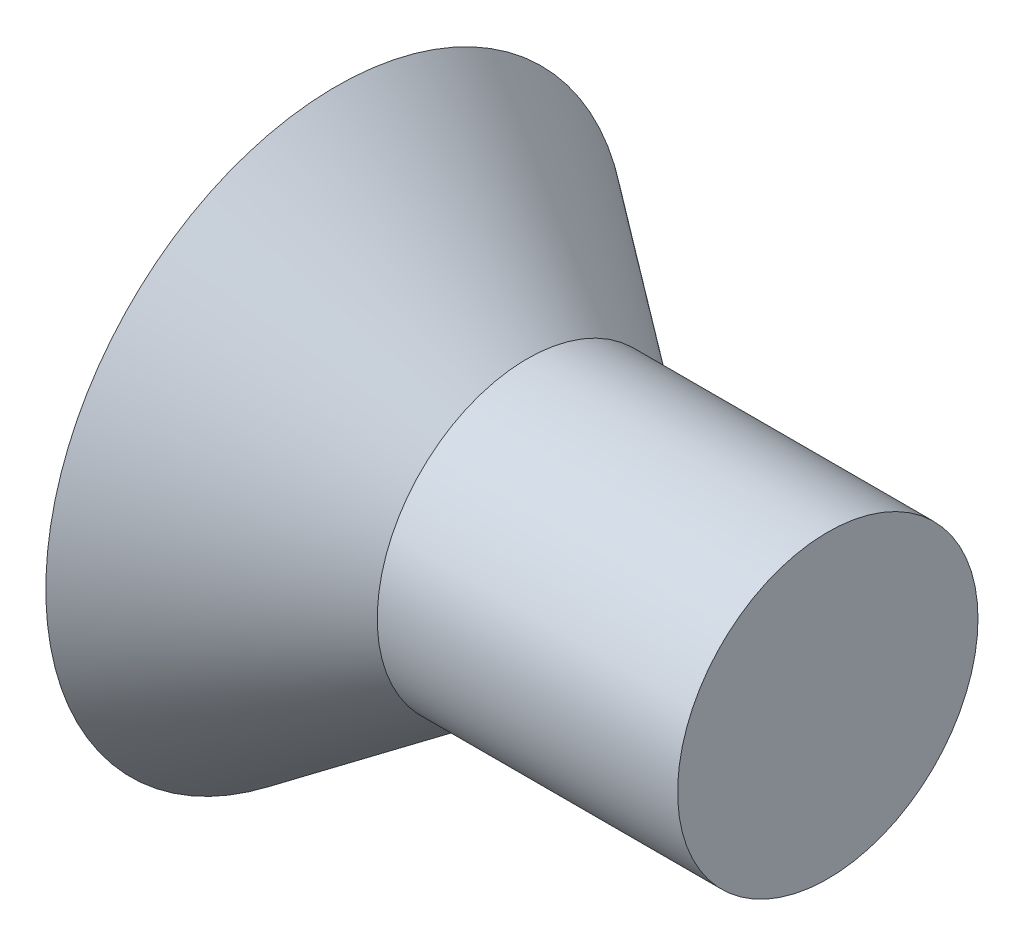
ISO-10303-21;
HEADER;
FILE_DESCRIPTION(('STEP AP214'),'2;1');
FILE_NAME('part.step','',(''),(''),'','','');
FILE_SCHEMA(('AUTOMOTIVE_DESIGN { 1 0 10303 214 1 1 1 1 }'));
ENDSEC;
DATA;
#1=APPLICATION_CONTEXT('core data for automotive mechanical design processes');
#2=APPLICATION_PROTOCOL_DEFINITION('international standard','automotive_design',2000,#1);
#3=PRODUCT_CONTEXT('',#1,'mechanical');
#4=PRODUCT('Part','Part','',(#3));
#5=PRODUCT_RELATED_PRODUCT_CATEGORY('part','',(#4));
#6=PRODUCT_DEFINITION_FORMATION('','',#4);
#7=PRODUCT_DEFINITION_CONTEXT('part definition',#1,'design');
#8=PRODUCT_DEFINITION('design','',#6,#7);
#9=PRODUCT_DEFINITION_SHAPE('','',#8);
#10=(LENGTH_UNIT() NAMED_UNIT(*) SI_UNIT(.MILLI.,.METRE.));
#11=(NAMED_UNIT(*) PLANE_ANGLE_UNIT() SI_UNIT($,.RADIAN.));
#12=(NAMED_UNIT(*) SI_UNIT($,.STERADIAN.) SOLID_ANGLE_UNIT());
#13=UNCERTAINTY_MEASURE_WITH_UNIT(LENGTH_MEASURE(1.E-05),#10,'distance_accuracy_value','');
#14=(GEOMETRIC_REPRESENTATION_CONTEXT(3) GLOBAL_UNCERTAINTY_ASSIGNED_CONTEXT((#13)) GLOBAL_UNIT_ASSIGNED_CONTEXT((#10,
#11,#12)) REPRESENTATION_CONTEXT('',''));
#15=CARTESIAN_POINT('',(0.,0.,0.));
#16=DIRECTION('',(0.,0.,1.));
#17=DIRECTION('',(1.,0.,0.));
#18=AXIS2_PLACEMENT_3D('',#15,#16,#17);
#19=CARTESIAN_POINT('',(4.91,0.,0.));
#20=DIRECTION('',(1.,0.,0.));
#21=DIRECTION('',(0.,0.,-1.));
#22=AXIS2_PLACEMENT_3D('',#19,#20,#21);
#23=CYLINDRICAL_SURFACE('',#22,1.5);
#24=CARTESIAN_POINT('',(1.91,0.,0.));
#25=DIRECTION('',(1.,0.,0.));
#26=DIRECTION('',(0.,0.,-1.));
#27=AXIS2_PLACEMENT_3D('',#24,#25,#26);
#28=CIRCLE('',#27,1.5);
#29=CARTESIAN_POINT('',(1.91,0.,-1.5));
#30=VERTEX_POINT('',#29);
#31=EDGE_CURVE('E11',#30,#30,#28,.T.);
#32=ORIENTED_EDGE('',*,*,#31,.T.);
#33=EDGE_LOOP('',(#32));
#34=FACE_BOUND('',#33,.T.);
#35=CARTESIAN_POINT('',(4.91,0.,0.));
#36=DIRECTION('',(1.,0.,0.));
#37=DIRECTION('',(0.,0.,-1.));
#38=AXIS2_PLACEMENT_3D('',#35,#36,#37);
#39=CIRCLE('',#38,1.5);
#40=CARTESIAN_POINT('',(4.91,0.,-1.5));
#41=VERTEX_POINT('',#40);
#42=EDGE_CURVE('E134',#41,#41,#39,.T.);
#43=ORIENTED_EDGE('',*,*,#42,.F.);
#44=EDGE_LOOP('',(#43));
#45=FACE_BOUND('',#44,.T.);
#46=ADVANCED_FACE('F33',(#34,#45),#23,.T.);
#47=CARTESIAN_POINT('',(1.91,0.,0.));
#48=DIRECTION('',(-1.,0.,0.));
#49=DIRECTION('',(0.,0.,1.));
#50=AXIS2_PLACEMENT_3D('',#47,#48,#49);
#51=CONICAL_SURFACE('',#50,1.5,0.632521820250123);
#52=CARTESIAN_POINT('',(0.,0.,0.));
#53=DIRECTION('',(1.,0.,0.));
#54=DIRECTION('',(0.,0.,-1.));
#55=AXIS2_PLACEMENT_3D('',#52,#53,#54);
#56=CIRCLE('',#55,2.9);
#57=CARTESIAN_POINT('',(0.,0.,-2.9));
#58=VERTEX_POINT('',#57);
#59=EDGE_CURVE('E40',#58,#58,#56,.T.);
#60=ORIENTED_EDGE('',*,*,#59,.T.);
#61=EDGE_LOOP('',(#60));
#62=FACE_BOUND('',#61,.T.);
#63=ORIENTED_EDGE('',*,*,#31,.F.);
#64=EDGE_LOOP('',(#63));
#65=FACE_BOUND('',#64,.T.);
#66=ADVANCED_FACE('F144',(#62,#65),#51,.T.);
#67=CARTESIAN_POINT('',(0.,2.9,0.));
#68=DIRECTION('',(-1.,0.,0.));
#69=DIRECTION('',(0.,0.,1.));
#70=AXIS2_PLACEMENT_3D('',#67,#68,#69);
#71=PLANE('',#70);
#72=DIRECTION('',(0.,0.866025403784439,0.5));
#73=VECTOR('',#72,1.);
#74=CARTESIAN_POINT('',(0.,-1.,0.577350269189626));
#75=LINE('',#74,#73);
#76=CARTESIAN_POINT('',(0.,-1.,0.577350269189626));
#77=VERTEX_POINT('',#76);
#78=CARTESIAN_POINT('',(0.,0.,1.15470053837925));
#79=VERTEX_POINT('',#78);
#80=EDGE_CURVE('E47',#77,#79,#75,.T.);
#81=ORIENTED_EDGE('',*,*,#80,.F.);
#82=DIRECTION('',(0.,0.,1.));
#83=VECTOR('',#82,1.);
#84=CARTESIAN_POINT('',(0.,-1.,-0.577350269189626));
#85=LINE('',#84,#83);
#86=CARTESIAN_POINT('',(0.,-1.,-0.577350269189626));
#87=VERTEX_POINT('',#86);
#88=EDGE_CURVE('E130',#87,#77,#85,.T.);
#89=ORIENTED_EDGE('',*,*,#88,.F.);
#90=DIRECTION('',(0.,-0.866025403784439,0.5));
#91=VECTOR('',#90,1.);
#92=CARTESIAN_POINT('',(0.,0.,-1.15470053837925));
#93=LINE('',#92,#91);
#94=CARTESIAN_POINT('',(0.,0.,-1.15470053837925));
#95=VERTEX_POINT('',#94);
#96=EDGE_CURVE('E128',#95,#87,#93,.T.);
#97=ORIENTED_EDGE('',*,*,#96,.F.);
#98=DIRECTION('',(0.,-0.866025403784439,-0.5));
#99=VECTOR('',#98,1.);
#100=CARTESIAN_POINT('',(0.,1.,-0.577350269189626));
#101=LINE('',#100,#99);
#102=CARTESIAN_POINT('',(0.,1.,-0.577350269189626));
#103=VERTEX_POINT('',#102);
#104=EDGE_CURVE('E95',#103,#95,#101,.T.);
#105=ORIENTED_EDGE('',*,*,#104,.F.);
#106=DIRECTION('',(0.,0.,-1.));
#107=VECTOR('',#106,1.);
#108=CARTESIAN_POINT('',(0.,1.,0.577350269189625));
#109=LINE('',#108,#107);
#110=CARTESIAN_POINT('',(0.,1.,0.577350269189625));
#111=VERTEX_POINT('',#110);
#112=EDGE_CURVE('E124',#111,#103,#109,.T.);
#113=ORIENTED_EDGE('',*,*,#112,.F.);
#114=DIRECTION('',(0.,0.866025403784438,-0.5));
#115=VECTOR('',#114,1.);
#116=CARTESIAN_POINT('',(0.,0.,1.15470053837925));
#117=LINE('',#116,#115);
#118=EDGE_CURVE('E121',#79,#111,#117,.T.);
#119=ORIENTED_EDGE('',*,*,#118,.F.);
#120=EDGE_LOOP('',(#81,#89,#97,#105,#113,#119));
#121=FACE_BOUND('',#120,.T.);
#122=ORIENTED_EDGE('',*,*,#59,.F.);
#123=EDGE_LOOP('',(#122));
#124=FACE_BOUND('',#123,.T.);
#125=ADVANCED_FACE('F147',(#121,#124),#71,.T.);
#126=CARTESIAN_POINT('',(4.91,0.,0.));
#127=DIRECTION('',(1.,0.,0.));
#128=DIRECTION('',(0.,0.,-1.));
#129=AXIS2_PLACEMENT_3D('',#126,#127,#128);
#130=PLANE('',#129);
#131=ORIENTED_EDGE('',*,*,#42,.T.);
#132=EDGE_LOOP('',(#131));
#133=FACE_BOUND('',#132,.T.);
#134=ADVANCED_FACE('F149',(#133),#130,.T.);
#135=CARTESIAN_POINT('',(1.,-1.,0.577350269189626));
#136=DIRECTION('',(0.,-0.5,0.866025403784439));
#137=DIRECTION('',(0.,-0.866025403784439,-0.5));
#138=AXIS2_PLACEMENT_3D('',#135,#136,#137);
#139=PLANE('',#138);
#140=ORIENTED_EDGE('',*,*,#80,.T.);
#141=DIRECTION('',(-1.,0.,0.));
#142=VECTOR('',#141,1.);
#143=CARTESIAN_POINT('',(1.,0.,1.15470053837925));
#144=LINE('',#143,#142);
#145=CARTESIAN_POINT('',(1.,0.,1.15470053837925));
#146=VERTEX_POINT('',#145);
#147=EDGE_CURVE('E77',#146,#79,#144,.T.);
#148=ORIENTED_EDGE('',*,*,#147,.F.);
#149=DIRECTION('',(0.,0.866025403784439,0.5));
#150=VECTOR('',#149,1.);
#151=CARTESIAN_POINT('',(1.,-1.,0.577350269189626));
#152=LINE('',#151,#150);
#153=CARTESIAN_POINT('',(1.,-1.,0.577350269189626));
#154=VERTEX_POINT('',#153);
#155=EDGE_CURVE('E132',#154,#146,#152,.T.);
#156=ORIENTED_EDGE('',*,*,#155,.F.);
#157=DIRECTION('',(-1.,0.,0.));
#158=VECTOR('',#157,1.);
#159=CARTESIAN_POINT('',(1.,-1.,0.577350269189626));
#160=LINE('',#159,#158);
#161=EDGE_CURVE('E55',#154,#77,#160,.T.);
#162=ORIENTED_EDGE('',*,*,#161,.T.);
#163=EDGE_LOOP('',(#140,#148,#156,#162));
#164=FACE_BOUND('',#163,.T.);
#165=ADVANCED_FACE('F156',(#164),#139,.F.);
#166=CARTESIAN_POINT('',(1.,-1.,-0.577350269189626));
#167=DIRECTION('',(0.,-1.,0.));
#168=DIRECTION('',(0.,0.,-1.));
#169=AXIS2_PLACEMENT_3D('',#166,#167,#168);
#170=PLANE('',#169);
#171=ORIENTED_EDGE('',*,*,#88,.T.);
#172=ORIENTED_EDGE('',*,*,#161,.F.);
#173=DIRECTION('',(0.,0.,1.));
#174=VECTOR('',#173,1.);
#175=CARTESIAN_POINT('',(1.,-1.,-0.577350269189626));
#176=LINE('',#175,#174);
#177=CARTESIAN_POINT('',(1.,-1.,-0.577350269189626));
#178=VERTEX_POINT('',#177);
#179=EDGE_CURVE('E107',#178,#154,#176,.T.);
#180=ORIENTED_EDGE('',*,*,#179,.F.);
#181=DIRECTION('',(-1.,0.,0.));
#182=VECTOR('',#181,1.);
#183=CARTESIAN_POINT('',(1.,-1.,-0.577350269189626));
#184=LINE('',#183,#182);
#185=EDGE_CURVE('E99',#178,#87,#184,.T.);
#186=ORIENTED_EDGE('',*,*,#185,.T.);
#187=EDGE_LOOP('',(#171,#172,#180,#186));
#188=FACE_BOUND('',#187,.T.);
#189=ADVANCED_FACE('F189',(#188),#170,.F.);
#190=CARTESIAN_POINT('',(1.,0.,-1.15470053837925));
#191=DIRECTION('',(0.,-0.5,-0.866025403784439));
#192=DIRECTION('',(0.,0.866025403784439,-0.5));
#193=AXIS2_PLACEMENT_3D('',#190,#191,#192);
#194=PLANE('',#193);
#195=ORIENTED_EDGE('',*,*,#96,.T.);
#196=ORIENTED_EDGE('',*,*,#185,.F.);
#197=DIRECTION('',(0.,-0.866025403784439,0.5));
#198=VECTOR('',#197,1.);
#199=CARTESIAN_POINT('',(1.,0.,-1.15470053837925));
#200=LINE('',#199,#198);
#201=CARTESIAN_POINT('',(1.,0.,-1.15470053837925));
#202=VERTEX_POINT('',#201);
#203=EDGE_CURVE('E103',#202,#178,#200,.T.);
#204=ORIENTED_EDGE('',*,*,#203,.F.);
#205=DIRECTION('',(-1.,0.,0.));
#206=VECTOR('',#205,1.);
#207=CARTESIAN_POINT('',(1.,0.,-1.15470053837925));
#208=LINE('',#207,#206);
#209=EDGE_CURVE('E88',#202,#95,#208,.T.);
#210=ORIENTED_EDGE('',*,*,#209,.T.);
#211=EDGE_LOOP('',(#195,#196,#204,#210));
#212=FACE_BOUND('',#211,.T.);
#213=ADVANCED_FACE('F104',(#212),#194,.F.);
#214=CARTESIAN_POINT('',(1.,1.,-0.577350269189626));
#215=DIRECTION('',(0.,0.5,-0.866025403784439));
#216=DIRECTION('',(0.,0.866025403784439,0.5));
#217=AXIS2_PLACEMENT_3D('',#214,#215,#216);
#218=PLANE('',#217);
#219=ORIENTED_EDGE('',*,*,#104,.T.);
#220=ORIENTED_EDGE('',*,*,#209,.F.);
#221=DIRECTION('',(0.,-0.866025403784439,-0.5));
#222=VECTOR('',#221,1.);
#223=CARTESIAN_POINT('',(1.,1.,-0.577350269189626));
#224=LINE('',#223,#222);
#225=CARTESIAN_POINT('',(1.,1.,-0.577350269189626));
#226=VERTEX_POINT('',#225);
#227=EDGE_CURVE('E92',#226,#202,#224,.T.);
#228=ORIENTED_EDGE('',*,*,#227,.F.);
#229=DIRECTION('',(-1.,0.,0.));
#230=VECTOR('',#229,1.);
#231=CARTESIAN_POINT('',(1.,1.,-0.577350269189626));
#232=LINE('',#231,#230);
#233=EDGE_CURVE('E100',#226,#103,#232,.T.);
#234=ORIENTED_EDGE('',*,*,#233,.T.);
#235=EDGE_LOOP('',(#219,#220,#228,#234));
#236=FACE_BOUND('',#235,.T.);
#237=ADVANCED_FACE('F90',(#236),#218,.F.);
#238=CARTESIAN_POINT('',(1.,1.,0.577350269189625));
#239=DIRECTION('',(0.,1.,0.));
#240=DIRECTION('',(0.,0.,1.));
#241=AXIS2_PLACEMENT_3D('',#238,#239,#240);
#242=PLANE('',#241);
#243=ORIENTED_EDGE('',*,*,#112,.T.);
#244=ORIENTED_EDGE('',*,*,#233,.F.);
#245=DIRECTION('',(0.,0.,-1.));
#246=VECTOR('',#245,1.);
#247=CARTESIAN_POINT('',(1.,1.,0.577350269189625));
#248=LINE('',#247,#246);
#249=CARTESIAN_POINT('',(1.,1.,0.577350269189625));
#250=VERTEX_POINT('',#249);
#251=EDGE_CURVE('E113',#250,#226,#248,.T.);
#252=ORIENTED_EDGE('',*,*,#251,.F.);
#253=DIRECTION('',(-1.,0.,0.));
#254=VECTOR('',#253,1.);
#255=CARTESIAN_POINT('',(1.,1.,0.577350269189625));
#256=LINE('',#255,#254);
#257=EDGE_CURVE('E137',#250,#111,#256,.T.);
#258=ORIENTED_EDGE('',*,*,#257,.T.);
#259=EDGE_LOOP('',(#243,#244,#252,#258));
#260=FACE_BOUND('',#259,.T.);
#261=ADVANCED_FACE('F214',(#260),#242,.F.);
#262=CARTESIAN_POINT('',(1.,0.,1.15470053837925));
#263=DIRECTION('',(0.,0.5,0.866025403784438));
#264=DIRECTION('',(0.,-0.866025403784439,0.5));
#265=AXIS2_PLACEMENT_3D('',#262,#263,#264);
#266=PLANE('',#265);
#267=ORIENTED_EDGE('',*,*,#118,.T.);
#268=ORIENTED_EDGE('',*,*,#257,.F.);
#269=DIRECTION('',(0.,0.866025403784438,-0.5));
#270=VECTOR('',#269,1.);
#271=CARTESIAN_POINT('',(1.,0.,1.15470053837925));
#272=LINE('',#271,#270);
#273=EDGE_CURVE('E115',#146,#250,#272,.T.);
#274=ORIENTED_EDGE('',*,*,#273,.F.);
#275=ORIENTED_EDGE('',*,*,#147,.T.);
#276=EDGE_LOOP('',(#267,#268,#274,#275));
#277=FACE_BOUND('',#276,.T.);
#278=ADVANCED_FACE('F223',(#277),#266,.F.);
#279=CARTESIAN_POINT('',(1.,0.,0.));
#280=DIRECTION('',(-1.,0.,0.));
#281=DIRECTION('',(0.,0.,1.));
#282=AXIS2_PLACEMENT_3D('',#279,#280,#281);
#283=PLANE('',#282);
#284=ORIENTED_EDGE('',*,*,#155,.T.);
#285=ORIENTED_EDGE('',*,*,#273,.T.);
#286=ORIENTED_EDGE('',*,*,#251,.T.);
#287=ORIENTED_EDGE('',*,*,#227,.T.);
#288=ORIENTED_EDGE('',*,*,#203,.T.);
#289=ORIENTED_EDGE('',*,*,#179,.T.);
#290=EDGE_LOOP('',(#284,#285,#286,#287,#288,#289));
#291=FACE_BOUND('',#290,.T.);
#292=ADVANCED_FACE('F110',(#291),#283,.T.);
#293=CLOSED_SHELL('',(#46,#66,#125,#134,#165,#189,#213,#237,#261,#278,#292));
#294=MANIFOLD_SOLID_BREP('B2',#293);
#295=ADVANCED_BREP_SHAPE_REPRESENTATION('',(#18,#294),#14);
#296=SHAPE_DEFINITION_REPRESENTATION(#9,#295);
ENDSEC;
END-ISO-10303-21;
